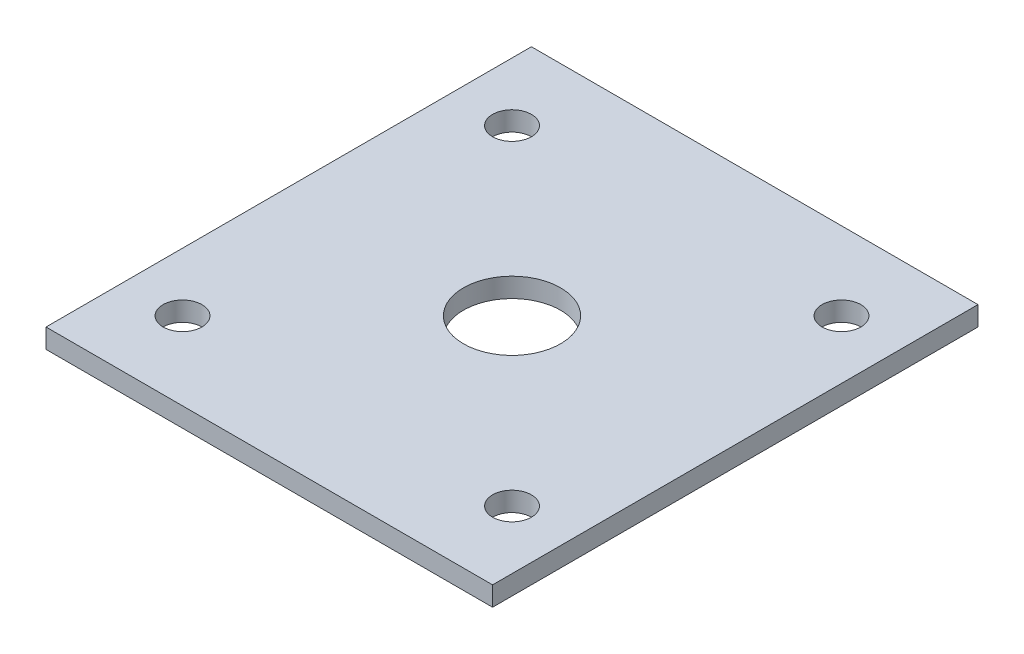
ISO-10303-21;
HEADER;
FILE_DESCRIPTION(('STEP AP214'),'2;1');
FILE_NAME('part.step','',(''),(''),'','','');
FILE_SCHEMA(('AUTOMOTIVE_DESIGN { 1 0 10303 214 1 1 1 1 }'));
ENDSEC;
DATA;
#1=APPLICATION_CONTEXT('core data for automotive mechanical design processes');
#2=APPLICATION_PROTOCOL_DEFINITION('international standard','automotive_design',2000,#1);
#3=PRODUCT_CONTEXT('',#1,'mechanical');
#4=PRODUCT('Part','Part','',(#3));
#5=PRODUCT_RELATED_PRODUCT_CATEGORY('part','',(#4));
#6=PRODUCT_DEFINITION_FORMATION('','',#4);
#7=PRODUCT_DEFINITION_CONTEXT('part definition',#1,'design');
#8=PRODUCT_DEFINITION('design','',#6,#7);
#9=PRODUCT_DEFINITION_SHAPE('','',#8);
#10=(LENGTH_UNIT() NAMED_UNIT(*) SI_UNIT(.MILLI.,.METRE.));
#11=(NAMED_UNIT(*) PLANE_ANGLE_UNIT() SI_UNIT($,.RADIAN.));
#12=(NAMED_UNIT(*) SI_UNIT($,.STERADIAN.) SOLID_ANGLE_UNIT());
#13=UNCERTAINTY_MEASURE_WITH_UNIT(LENGTH_MEASURE(1.E-05),#10,'distance_accuracy_value','');
#14=(GEOMETRIC_REPRESENTATION_CONTEXT(3) GLOBAL_UNCERTAINTY_ASSIGNED_CONTEXT((#13)) GLOBAL_UNIT_ASSIGNED_CONTEXT((#10,
#11,#12)) REPRESENTATION_CONTEXT('',''));
#15=CARTESIAN_POINT('',(0.,0.,0.));
#16=DIRECTION('',(0.,0.,1.));
#17=DIRECTION('',(1.,0.,0.));
#18=AXIS2_PLACEMENT_3D('',#15,#16,#17);
#19=CARTESIAN_POINT('',(23.,2.,-25.));
#20=DIRECTION('',(-1.,0.,0.));
#21=DIRECTION('',(0.,0.,1.));
#22=AXIS2_PLACEMENT_3D('',#19,#20,#21);
#23=PLANE('',#22);
#24=DIRECTION('',(0.,0.,-1.));
#25=VECTOR('',#24,1.);
#26=CARTESIAN_POINT('',(23.,0.,-25.));
#27=LINE('',#26,#25);
#28=CARTESIAN_POINT('',(23.,0.,25.));
#29=VERTEX_POINT('',#28);
#30=CARTESIAN_POINT('',(23.,0.,-25.));
#31=VERTEX_POINT('',#30);
#32=EDGE_CURVE('E107',#29,#31,#27,.T.);
#33=ORIENTED_EDGE('',*,*,#32,.T.);
#34=DIRECTION('',(0.,-1.,0.));
#35=VECTOR('',#34,1.);
#36=CARTESIAN_POINT('',(23.,2.,-25.));
#37=LINE('',#36,#35);
#38=CARTESIAN_POINT('',(23.,2.,-25.));
#39=VERTEX_POINT('',#38);
#40=EDGE_CURVE('E11',#39,#31,#37,.T.);
#41=ORIENTED_EDGE('',*,*,#40,.F.);
#42=DIRECTION('',(0.,0.,-1.));
#43=VECTOR('',#42,1.);
#44=CARTESIAN_POINT('',(23.,2.,-25.));
#45=LINE('',#44,#43);
#46=CARTESIAN_POINT('',(23.,2.,25.));
#47=VERTEX_POINT('',#46);
#48=EDGE_CURVE('E91',#47,#39,#45,.T.);
#49=ORIENTED_EDGE('',*,*,#48,.F.);
#50=DIRECTION('',(0.,-1.,0.));
#51=VECTOR('',#50,1.);
#52=CARTESIAN_POINT('',(23.,2.,25.));
#53=LINE('',#52,#51);
#54=EDGE_CURVE('E103',#47,#29,#53,.T.);
#55=ORIENTED_EDGE('',*,*,#54,.T.);
#56=EDGE_LOOP('',(#33,#41,#49,#55));
#57=FACE_BOUND('',#56,.T.);
#58=ADVANCED_FACE('F39',(#57),#23,.F.);
#59=CARTESIAN_POINT('',(-23.,2.,-25.));
#60=DIRECTION('',(0.,0.,1.));
#61=DIRECTION('',(1.,0.,0.));
#62=AXIS2_PLACEMENT_3D('',#59,#60,#61);
#63=PLANE('',#62);
#64=DIRECTION('',(-1.,0.,0.));
#65=VECTOR('',#64,1.);
#66=CARTESIAN_POINT('',(-23.,0.,-25.));
#67=LINE('',#66,#65);
#68=CARTESIAN_POINT('',(-23.,0.,-25.));
#69=VERTEX_POINT('',#68);
#70=EDGE_CURVE('E96',#31,#69,#67,.T.);
#71=ORIENTED_EDGE('',*,*,#70,.T.);
#72=DIRECTION('',(0.,-1.,0.));
#73=VECTOR('',#72,1.);
#74=CARTESIAN_POINT('',(-23.,2.,-25.));
#75=LINE('',#74,#73);
#76=CARTESIAN_POINT('',(-23.,2.,-25.));
#77=VERTEX_POINT('',#76);
#78=EDGE_CURVE('E48',#77,#69,#75,.T.);
#79=ORIENTED_EDGE('',*,*,#78,.F.);
#80=DIRECTION('',(-1.,0.,0.));
#81=VECTOR('',#80,1.);
#82=CARTESIAN_POINT('',(-23.,2.,-25.));
#83=LINE('',#82,#81);
#84=EDGE_CURVE('E86',#39,#77,#83,.T.);
#85=ORIENTED_EDGE('',*,*,#84,.F.);
#86=ORIENTED_EDGE('',*,*,#40,.T.);
#87=EDGE_LOOP('',(#71,#79,#85,#86));
#88=FACE_BOUND('',#87,.T.);
#89=ADVANCED_FACE('F95',(#88),#63,.F.);
#90=CARTESIAN_POINT('',(-23.,2.,-25.));
#91=DIRECTION('',(1.,0.,0.));
#92=DIRECTION('',(0.,0.,-1.));
#93=AXIS2_PLACEMENT_3D('',#90,#91,#92);
#94=PLANE('',#93);
#95=DIRECTION('',(0.,0.,1.));
#96=VECTOR('',#95,1.);
#97=CARTESIAN_POINT('',(-23.,0.,-25.));
#98=LINE('',#97,#96);
#99=CARTESIAN_POINT('',(-23.,0.,25.));
#100=VERTEX_POINT('',#99);
#101=EDGE_CURVE('E73',#69,#100,#98,.T.);
#102=ORIENTED_EDGE('',*,*,#101,.T.);
#103=DIRECTION('',(0.,-1.,0.));
#104=VECTOR('',#103,1.);
#105=CARTESIAN_POINT('',(-23.,2.,25.));
#106=LINE('',#105,#104);
#107=CARTESIAN_POINT('',(-23.,2.,25.));
#108=VERTEX_POINT('',#107);
#109=EDGE_CURVE('E98',#108,#100,#106,.T.);
#110=ORIENTED_EDGE('',*,*,#109,.F.);
#111=DIRECTION('',(0.,0.,1.));
#112=VECTOR('',#111,1.);
#113=CARTESIAN_POINT('',(-23.,2.,-25.));
#114=LINE('',#113,#112);
#115=EDGE_CURVE('E89',#77,#108,#114,.T.);
#116=ORIENTED_EDGE('',*,*,#115,.F.);
#117=ORIENTED_EDGE('',*,*,#78,.T.);
#118=EDGE_LOOP('',(#102,#110,#116,#117));
#119=FACE_BOUND('',#118,.T.);
#120=ADVANCED_FACE('F99',(#119),#94,.F.);
#121=CARTESIAN_POINT('',(-23.,2.,25.));
#122=DIRECTION('',(0.,0.,-1.));
#123=DIRECTION('',(-1.,0.,0.));
#124=AXIS2_PLACEMENT_3D('',#121,#122,#123);
#125=PLANE('',#124);
#126=DIRECTION('',(1.,0.,0.));
#127=VECTOR('',#126,1.);
#128=CARTESIAN_POINT('',(-23.,0.,25.));
#129=LINE('',#128,#127);
#130=EDGE_CURVE('E79',#100,#29,#129,.T.);
#131=ORIENTED_EDGE('',*,*,#130,.T.);
#132=ORIENTED_EDGE('',*,*,#54,.F.);
#133=DIRECTION('',(1.,0.,0.));
#134=VECTOR('',#133,1.);
#135=CARTESIAN_POINT('',(-23.,2.,25.));
#136=LINE('',#135,#134);
#137=EDGE_CURVE('E56',#108,#47,#136,.T.);
#138=ORIENTED_EDGE('',*,*,#137,.F.);
#139=ORIENTED_EDGE('',*,*,#109,.T.);
#140=EDGE_LOOP('',(#131,#132,#138,#139));
#141=FACE_BOUND('',#140,.T.);
#142=ADVANCED_FACE('F121',(#141),#125,.F.);
#143=CARTESIAN_POINT('',(0.,2.,0.));
#144=DIRECTION('',(0.,1.,0.));
#145=DIRECTION('',(0.,0.,1.));
#146=AXIS2_PLACEMENT_3D('',#143,#144,#145);
#147=PLANE('',#146);
#148=CARTESIAN_POINT('',(-16.9692719333992,2.,-16.9692719333992));
#149=DIRECTION('',(0.,1.,0.));
#150=DIRECTION('',(0.,0.,1.));
#151=AXIS2_PLACEMENT_3D('',#148,#149,#150);
#152=CIRCLE('',#151,2.);
#153=CARTESIAN_POINT('',(-16.9692719333992,2.,-14.9692719333992));
#154=VERTEX_POINT('',#153);
#155=EDGE_CURVE('E153',#154,#154,#152,.T.);
#156=ORIENTED_EDGE('',*,*,#155,.F.);
#157=EDGE_LOOP('',(#156));
#158=FACE_BOUND('',#157,.T.);
#159=CARTESIAN_POINT('',(16.9692697239666,2.,16.9692697239667));
#160=DIRECTION('',(0.,1.,0.));
#161=DIRECTION('',(0.,0.,1.));
#162=AXIS2_PLACEMENT_3D('',#159,#160,#161);
#163=CIRCLE('',#162,2.);
#164=CARTESIAN_POINT('',(16.9692697239666,2.,18.9692697239667));
#165=VERTEX_POINT('',#164);
#166=EDGE_CURVE('E144',#165,#165,#163,.T.);
#167=ORIENTED_EDGE('',*,*,#166,.F.);
#168=EDGE_LOOP('',(#167));
#169=FACE_BOUND('',#168,.T.);
#170=CARTESIAN_POINT('',(-16.9692685810991,2.,16.9692685810992));
#171=DIRECTION('',(0.,1.,0.));
#172=DIRECTION('',(0.,0.,1.));
#173=AXIS2_PLACEMENT_3D('',#170,#171,#172);
#174=CIRCLE('',#173,2.);
#175=CARTESIAN_POINT('',(-16.9692685810991,2.,18.9692685810992));
#176=VERTEX_POINT('',#175);
#177=EDGE_CURVE('E160',#176,#176,#174,.T.);
#178=ORIENTED_EDGE('',*,*,#177,.F.);
#179=EDGE_LOOP('',(#178));
#180=FACE_BOUND('',#179,.T.);
#181=CARTESIAN_POINT('',(16.9692697239666,2.,-16.9692697239667));
#182=DIRECTION('',(0.,1.,0.));
#183=DIRECTION('',(0.,0.,1.));
#184=AXIS2_PLACEMENT_3D('',#181,#182,#183);
#185=CIRCLE('',#184,2.);
#186=CARTESIAN_POINT('',(16.9692697239666,2.,-14.9692697239667));
#187=VERTEX_POINT('',#186);
#188=EDGE_CURVE('E136',#187,#187,#185,.T.);
#189=ORIENTED_EDGE('',*,*,#188,.F.);
#190=EDGE_LOOP('',(#189));
#191=FACE_BOUND('',#190,.T.);
#192=CARTESIAN_POINT('',(0.,2.,0.));
#193=DIRECTION('',(0.,1.,0.));
#194=DIRECTION('',(0.,0.,1.));
#195=AXIS2_PLACEMENT_3D('',#192,#193,#194);
#196=CIRCLE('',#195,5.);
#197=CARTESIAN_POINT('',(0.,2.,5.));
#198=VERTEX_POINT('',#197);
#199=EDGE_CURVE('E128',#198,#198,#196,.T.);
#200=ORIENTED_EDGE('',*,*,#199,.F.);
#201=EDGE_LOOP('',(#200));
#202=FACE_BOUND('',#201,.T.);
#203=ORIENTED_EDGE('',*,*,#48,.T.);
#204=ORIENTED_EDGE('',*,*,#84,.T.);
#205=ORIENTED_EDGE('',*,*,#115,.T.);
#206=ORIENTED_EDGE('',*,*,#137,.T.);
#207=EDGE_LOOP('',(#203,#204,#205,#206));
#208=FACE_BOUND('',#207,.T.);
#209=ADVANCED_FACE('F87',(#158,#169,#180,#191,#202,#208),#147,.T.);
#210=CARTESIAN_POINT('',(0.,0.,0.));
#211=DIRECTION('',(0.,1.,0.));
#212=DIRECTION('',(0.,0.,1.));
#213=AXIS2_PLACEMENT_3D('',#210,#211,#212);
#214=PLANE('',#213);
#215=CARTESIAN_POINT('',(-16.9692719333992,0.,-16.9692719333992));
#216=DIRECTION('',(0.,1.,0.));
#217=DIRECTION('',(0.,0.,1.));
#218=AXIS2_PLACEMENT_3D('',#215,#216,#217);
#219=CIRCLE('',#218,2.);
#220=CARTESIAN_POINT('',(-16.9692719333992,0.,-14.9692719333992));
#221=VERTEX_POINT('',#220);
#222=EDGE_CURVE('E140',#221,#221,#219,.T.);
#223=ORIENTED_EDGE('',*,*,#222,.T.);
#224=EDGE_LOOP('',(#223));
#225=FACE_BOUND('',#224,.T.);
#226=CARTESIAN_POINT('',(16.9692697239666,0.,16.9692697239667));
#227=DIRECTION('',(0.,1.,0.));
#228=DIRECTION('',(0.,0.,1.));
#229=AXIS2_PLACEMENT_3D('',#226,#227,#228);
#230=CIRCLE('',#229,2.);
#231=CARTESIAN_POINT('',(16.9692697239666,0.,18.9692697239667));
#232=VERTEX_POINT('',#231);
#233=EDGE_CURVE('E148',#232,#232,#230,.T.);
#234=ORIENTED_EDGE('',*,*,#233,.T.);
#235=EDGE_LOOP('',(#234));
#236=FACE_BOUND('',#235,.T.);
#237=CARTESIAN_POINT('',(-16.9692685810991,0.,16.9692685810992));
#238=DIRECTION('',(0.,1.,0.));
#239=DIRECTION('',(0.,0.,1.));
#240=AXIS2_PLACEMENT_3D('',#237,#238,#239);
#241=CIRCLE('',#240,2.);
#242=CARTESIAN_POINT('',(-16.9692685810991,0.,18.9692685810992));
#243=VERTEX_POINT('',#242);
#244=EDGE_CURVE('E149',#243,#243,#241,.T.);
#245=ORIENTED_EDGE('',*,*,#244,.T.);
#246=EDGE_LOOP('',(#245));
#247=FACE_BOUND('',#246,.T.);
#248=CARTESIAN_POINT('',(16.9692697239666,0.,-16.9692697239667));
#249=DIRECTION('',(0.,1.,0.));
#250=DIRECTION('',(0.,0.,1.));
#251=AXIS2_PLACEMENT_3D('',#248,#249,#250);
#252=CIRCLE('',#251,2.);
#253=CARTESIAN_POINT('',(16.9692697239666,0.,-14.9692697239667));
#254=VERTEX_POINT('',#253);
#255=EDGE_CURVE('E132',#254,#254,#252,.T.);
#256=ORIENTED_EDGE('',*,*,#255,.T.);
#257=EDGE_LOOP('',(#256));
#258=FACE_BOUND('',#257,.T.);
#259=CARTESIAN_POINT('',(0.,0.,0.));
#260=DIRECTION('',(0.,1.,0.));
#261=DIRECTION('',(0.,0.,1.));
#262=AXIS2_PLACEMENT_3D('',#259,#260,#261);
#263=CIRCLE('',#262,5.);
#264=CARTESIAN_POINT('',(0.,0.,5.));
#265=VERTEX_POINT('',#264);
#266=EDGE_CURVE('E111',#265,#265,#263,.T.);
#267=ORIENTED_EDGE('',*,*,#266,.T.);
#268=EDGE_LOOP('',(#267));
#269=FACE_BOUND('',#268,.T.);
#270=ORIENTED_EDGE('',*,*,#32,.F.);
#271=ORIENTED_EDGE('',*,*,#130,.F.);
#272=ORIENTED_EDGE('',*,*,#101,.F.);
#273=ORIENTED_EDGE('',*,*,#70,.F.);
#274=EDGE_LOOP('',(#270,#271,#272,#273));
#275=FACE_BOUND('',#274,.T.);
#276=ADVANCED_FACE('F124',(#225,#236,#247,#258,#269,#275),#214,.F.);
#277=CARTESIAN_POINT('',(0.,0.,0.));
#278=DIRECTION('',(0.,1.,0.));
#279=DIRECTION('',(0.,0.,1.));
#280=AXIS2_PLACEMENT_3D('',#277,#278,#279);
#281=CYLINDRICAL_SURFACE('',#280,5.);
#282=ORIENTED_EDGE('',*,*,#266,.F.);
#283=EDGE_LOOP('',(#282));
#284=FACE_BOUND('',#283,.T.);
#285=ORIENTED_EDGE('',*,*,#199,.T.);
#286=EDGE_LOOP('',(#285));
#287=FACE_BOUND('',#286,.T.);
#288=ADVANCED_FACE('F186',(#284,#287),#281,.F.);
#289=CARTESIAN_POINT('',(16.9692697239666,0.,-16.9692697239667));
#290=DIRECTION('',(0.,1.,0.));
#291=DIRECTION('',(0.,0.,1.));
#292=AXIS2_PLACEMENT_3D('',#289,#290,#291);
#293=CYLINDRICAL_SURFACE('',#292,2.);
#294=ORIENTED_EDGE('',*,*,#255,.F.);
#295=EDGE_LOOP('',(#294));
#296=FACE_BOUND('',#295,.T.);
#297=ORIENTED_EDGE('',*,*,#188,.T.);
#298=EDGE_LOOP('',(#297));
#299=FACE_BOUND('',#298,.T.);
#300=ADVANCED_FACE('F174',(#296,#299),#293,.F.);
#301=CARTESIAN_POINT('',(-16.9692685810991,0.,16.9692685810992));
#302=DIRECTION('',(0.,1.,0.));
#303=DIRECTION('',(0.,0.,1.));
#304=AXIS2_PLACEMENT_3D('',#301,#302,#303);
#305=CYLINDRICAL_SURFACE('',#304,2.);
#306=ORIENTED_EDGE('',*,*,#244,.F.);
#307=EDGE_LOOP('',(#306));
#308=FACE_BOUND('',#307,.T.);
#309=ORIENTED_EDGE('',*,*,#177,.T.);
#310=EDGE_LOOP('',(#309));
#311=FACE_BOUND('',#310,.T.);
#312=ADVANCED_FACE('F170',(#308,#311),#305,.F.);
#313=CARTESIAN_POINT('',(16.9692697239666,0.,16.9692697239667));
#314=DIRECTION('',(0.,1.,0.));
#315=DIRECTION('',(0.,0.,1.));
#316=AXIS2_PLACEMENT_3D('',#313,#314,#315);
#317=CYLINDRICAL_SURFACE('',#316,2.);
#318=ORIENTED_EDGE('',*,*,#233,.F.);
#319=EDGE_LOOP('',(#318));
#320=FACE_BOUND('',#319,.T.);
#321=ORIENTED_EDGE('',*,*,#166,.T.);
#322=EDGE_LOOP('',(#321));
#323=FACE_BOUND('',#322,.T.);
#324=ADVANCED_FACE('F173',(#320,#323),#317,.F.);
#325=CARTESIAN_POINT('',(-16.9692719333992,0.,-16.9692719333992));
#326=DIRECTION('',(0.,1.,0.));
#327=DIRECTION('',(0.,0.,1.));
#328=AXIS2_PLACEMENT_3D('',#325,#326,#327);
#329=CYLINDRICAL_SURFACE('',#328,2.);
#330=ORIENTED_EDGE('',*,*,#222,.F.);
#331=EDGE_LOOP('',(#330));
#332=FACE_BOUND('',#331,.T.);
#333=ORIENTED_EDGE('',*,*,#155,.T.);
#334=EDGE_LOOP('',(#333));
#335=FACE_BOUND('',#334,.T.);
#336=ADVANCED_FACE('F243',(#332,#335),#329,.F.);
#337=CLOSED_SHELL('',(#58,#89,#120,#142,#209,#276,#288,#300,#312,#324,#336));
#338=MANIFOLD_SOLID_BREP('B2',#337);
#339=ADVANCED_BREP_SHAPE_REPRESENTATION('',(#18,#338),#14);
#340=SHAPE_DEFINITION_REPRESENTATION(#9,#339);
ENDSEC;
END-ISO-10303-21;
